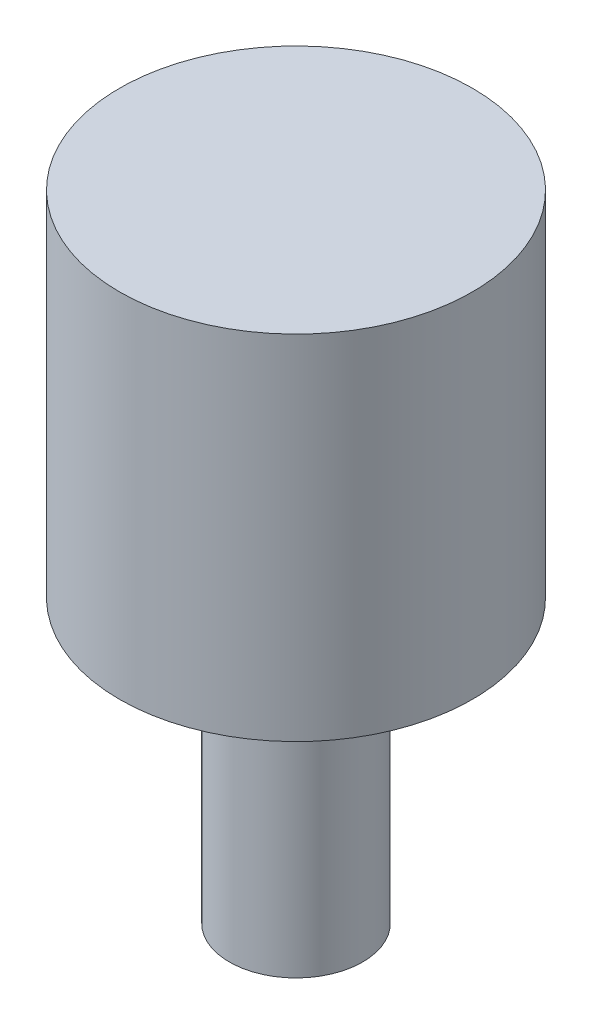
ISO-10303-21;
HEADER;
FILE_DESCRIPTION(('STEP AP214'),'2;1');
FILE_NAME('part.step','',(''),(''),'','','');
FILE_SCHEMA(('AUTOMOTIVE_DESIGN { 1 0 10303 214 1 1 1 1 }'));
ENDSEC;
DATA;
#1=APPLICATION_CONTEXT('core data for automotive mechanical design processes');
#2=APPLICATION_PROTOCOL_DEFINITION('international standard','automotive_design',2000,#1);
#3=PRODUCT_CONTEXT('',#1,'mechanical');
#4=PRODUCT('Part','Part','',(#3));
#5=PRODUCT_RELATED_PRODUCT_CATEGORY('part','',(#4));
#6=PRODUCT_DEFINITION_FORMATION('','',#4);
#7=PRODUCT_DEFINITION_CONTEXT('part definition',#1,'design');
#8=PRODUCT_DEFINITION('design','',#6,#7);
#9=PRODUCT_DEFINITION_SHAPE('','',#8);
#10=(LENGTH_UNIT() NAMED_UNIT(*) SI_UNIT(.MILLI.,.METRE.));
#11=(NAMED_UNIT(*) PLANE_ANGLE_UNIT() SI_UNIT($,.RADIAN.));
#12=(NAMED_UNIT(*) SI_UNIT($,.STERADIAN.) SOLID_ANGLE_UNIT());
#13=UNCERTAINTY_MEASURE_WITH_UNIT(LENGTH_MEASURE(1.E-05),#10,'distance_accuracy_value','');
#14=(GEOMETRIC_REPRESENTATION_CONTEXT(3) GLOBAL_UNCERTAINTY_ASSIGNED_CONTEXT((#13)) GLOBAL_UNIT_ASSIGNED_CONTEXT((#10,
#11,#12)) REPRESENTATION_CONTEXT('',''));
#15=CARTESIAN_POINT('',(0.,0.,0.));
#16=DIRECTION('',(0.,0.,1.));
#17=DIRECTION('',(1.,0.,0.));
#18=AXIS2_PLACEMENT_3D('',#15,#16,#17);
#19=CARTESIAN_POINT('',(0.,7.9375,0.));
#20=DIRECTION('',(0.,-1.,0.));
#21=DIRECTION('',(0.,0.,-1.));
#22=AXIS2_PLACEMENT_3D('',#19,#20,#21);
#23=CYLINDRICAL_SURFACE('',#22,3.96875);
#24=CARTESIAN_POINT('',(0.,7.9375,0.));
#25=DIRECTION('',(0.,1.,0.));
#26=DIRECTION('',(0.,0.,1.));
#27=AXIS2_PLACEMENT_3D('',#24,#25,#26);
#28=CIRCLE('',#27,3.96875);
#29=CARTESIAN_POINT('',(0.,7.9375,3.96875));
#30=VERTEX_POINT('',#29);
#31=EDGE_CURVE('E49',#30,#30,#28,.T.);
#32=ORIENTED_EDGE('',*,*,#31,.F.);
#33=EDGE_LOOP('',(#32));
#34=FACE_BOUND('',#33,.T.);
#35=CARTESIAN_POINT('',(0.,0.,0.));
#36=DIRECTION('',(0.,1.,0.));
#37=DIRECTION('',(0.,0.,1.));
#38=AXIS2_PLACEMENT_3D('',#35,#36,#37);
#39=CIRCLE('',#38,3.96875);
#40=CARTESIAN_POINT('',(0.,0.,3.96875));
#41=VERTEX_POINT('',#40);
#42=EDGE_CURVE('E45',#41,#41,#39,.T.);
#43=ORIENTED_EDGE('',*,*,#42,.T.);
#44=EDGE_LOOP('',(#43));
#45=FACE_BOUND('',#44,.T.);
#46=ADVANCED_FACE('F42',(#34,#45),#23,.T.);
#47=CARTESIAN_POINT('',(0.,7.9375,0.));
#48=DIRECTION('',(0.,1.,0.));
#49=DIRECTION('',(0.,0.,1.));
#50=AXIS2_PLACEMENT_3D('',#47,#48,#49);
#51=PLANE('',#50);
#52=ORIENTED_EDGE('',*,*,#31,.T.);
#53=EDGE_LOOP('',(#52));
#54=FACE_BOUND('',#53,.T.);
#55=ADVANCED_FACE('F66',(#54),#51,.T.);
#56=CARTESIAN_POINT('',(0.,0.,0.));
#57=DIRECTION('',(0.,1.,0.));
#58=DIRECTION('',(0.,0.,1.));
#59=AXIS2_PLACEMENT_3D('',#56,#57,#58);
#60=PLANE('',#59);
#61=CARTESIAN_POINT('',(0.,0.,0.));
#62=DIRECTION('',(0.,-1.,0.));
#63=DIRECTION('',(0.,0.,-1.));
#64=AXIS2_PLACEMENT_3D('',#61,#62,#63);
#65=CIRCLE('',#64,1.5);
#66=CARTESIAN_POINT('',(0.,0.,-1.5));
#67=VERTEX_POINT('',#66);
#68=EDGE_CURVE('E10',#67,#67,#65,.T.);
#69=ORIENTED_EDGE('',*,*,#68,.F.);
#70=EDGE_LOOP('',(#69));
#71=FACE_BOUND('',#70,.T.);
#72=ORIENTED_EDGE('',*,*,#42,.F.);
#73=EDGE_LOOP('',(#72));
#74=FACE_BOUND('',#73,.T.);
#75=ADVANCED_FACE('F63',(#71,#74),#60,.F.);
#76=CARTESIAN_POINT('',(0.,-6.35,0.));
#77=DIRECTION('',(0.,1.,0.));
#78=DIRECTION('',(0.,0.,1.));
#79=AXIS2_PLACEMENT_3D('',#76,#77,#78);
#80=CYLINDRICAL_SURFACE('',#79,1.5);
#81=CARTESIAN_POINT('',(0.,-6.35,0.));
#82=DIRECTION('',(0.,-1.,0.));
#83=DIRECTION('',(0.,0.,-1.));
#84=AXIS2_PLACEMENT_3D('',#81,#82,#83);
#85=CIRCLE('',#84,1.5);
#86=CARTESIAN_POINT('',(0.,-6.35,-1.5));
#87=VERTEX_POINT('',#86);
#88=EDGE_CURVE('E55',#87,#87,#85,.T.);
#89=ORIENTED_EDGE('',*,*,#88,.F.);
#90=EDGE_LOOP('',(#89));
#91=FACE_BOUND('',#90,.T.);
#92=ORIENTED_EDGE('',*,*,#68,.T.);
#93=EDGE_LOOP('',(#92));
#94=FACE_BOUND('',#93,.T.);
#95=ADVANCED_FACE('F65',(#91,#94),#80,.T.);
#96=CARTESIAN_POINT('',(0.,-6.35,0.));
#97=DIRECTION('',(0.,-1.,0.));
#98=DIRECTION('',(0.,0.,-1.));
#99=AXIS2_PLACEMENT_3D('',#96,#97,#98);
#100=PLANE('',#99);
#101=ORIENTED_EDGE('',*,*,#88,.T.);
#102=EDGE_LOOP('',(#101));
#103=FACE_BOUND('',#102,.T.);
#104=ADVANCED_FACE('F72',(#103),#100,.T.);
#105=CLOSED_SHELL('',(#46,#55,#75,#95,#104));
#106=MANIFOLD_SOLID_BREP('B2',#105);
#107=ADVANCED_BREP_SHAPE_REPRESENTATION('',(#18,#106),#14);
#108=SHAPE_DEFINITION_REPRESENTATION(#9,#107);
ENDSEC;
END-ISO-10303-21;
